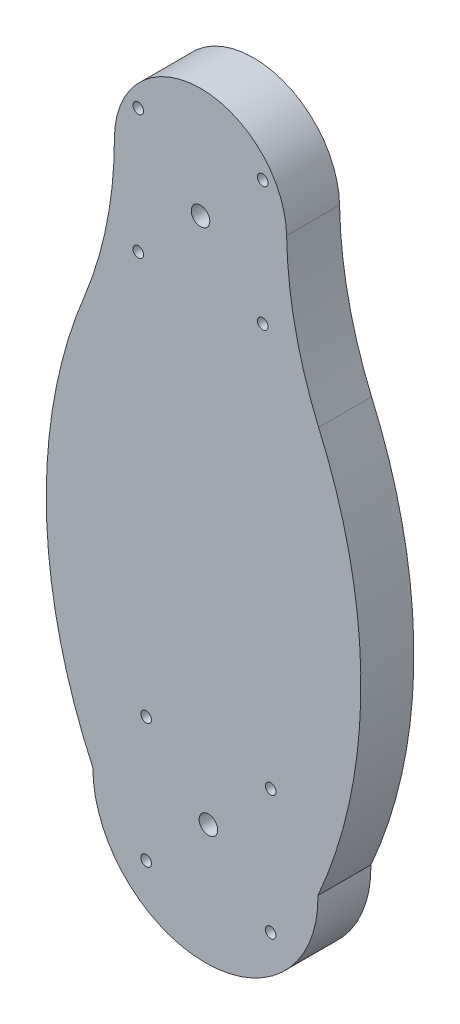
ISO-10303-21;
HEADER;
FILE_DESCRIPTION(('STEP AP214'),'2;1');
FILE_NAME('part.step','',(''),(''),'','','');
FILE_SCHEMA(('AUTOMOTIVE_DESIGN { 1 0 10303 214 1 1 1 1 }'));
ENDSEC;
DATA;
#1=APPLICATION_CONTEXT('core data for automotive mechanical design processes');
#2=APPLICATION_PROTOCOL_DEFINITION('international standard','automotive_design',2000,#1);
#3=PRODUCT_CONTEXT('',#1,'mechanical');
#4=PRODUCT('Part','Part','',(#3));
#5=PRODUCT_RELATED_PRODUCT_CATEGORY('part','',(#4));
#6=PRODUCT_DEFINITION_FORMATION('','',#4);
#7=PRODUCT_DEFINITION_CONTEXT('part definition',#1,'design');
#8=PRODUCT_DEFINITION('design','',#6,#7);
#9=PRODUCT_DEFINITION_SHAPE('','',#8);
#10=(LENGTH_UNIT() NAMED_UNIT(*) SI_UNIT(.MILLI.,.METRE.));
#11=(NAMED_UNIT(*) PLANE_ANGLE_UNIT() SI_UNIT($,.RADIAN.));
#12=(NAMED_UNIT(*) SI_UNIT($,.STERADIAN.) SOLID_ANGLE_UNIT());
#13=UNCERTAINTY_MEASURE_WITH_UNIT(LENGTH_MEASURE(1.E-05),#10,'distance_accuracy_value','');
#14=(GEOMETRIC_REPRESENTATION_CONTEXT(3) GLOBAL_UNCERTAINTY_ASSIGNED_CONTEXT((#13)) GLOBAL_UNIT_ASSIGNED_CONTEXT((#10,
#11,#12)) REPRESENTATION_CONTEXT('',''));
#15=CARTESIAN_POINT('',(0.,0.,0.));
#16=DIRECTION('',(0.,0.,1.));
#17=DIRECTION('',(1.,0.,0.));
#18=AXIS2_PLACEMENT_3D('',#15,#16,#17);
#19=CARTESIAN_POINT('',(-185.472627062232,165.030575769982,20.));
#20=DIRECTION('',(0.,0.,-1.));
#21=DIRECTION('',(-1.,0.,0.));
#22=AXIS2_PLACEMENT_3D('',#19,#20,#21);
#23=CYLINDRICAL_SURFACE('',#22,151.128455090654);
#24=CARTESIAN_POINT('',(-185.472627062232,165.030575769982,0.));
#25=DIRECTION('',(0.,0.,-1.));
#26=DIRECTION('',(-1.,0.,0.));
#27=AXIS2_PLACEMENT_3D('',#24,#25,#26);
#28=CIRCLE('',#27,151.128455090654);
#29=CARTESIAN_POINT('',(-34.344171971578,165.030575769983,0.));
#30=VERTEX_POINT('',#29);
#31=CARTESIAN_POINT('',(-45.4471219229253,108.174020751499,0.));
#32=VERTEX_POINT('',#31);
#33=EDGE_CURVE('E118',#30,#32,#28,.T.);
#34=ORIENTED_EDGE('',*,*,#33,.T.);
#35=DIRECTION('',(0.,0.,-1.));
#36=VECTOR('',#35,1.);
#37=CARTESIAN_POINT('',(-45.4471219229253,108.174020751499,20.));
#38=LINE('',#37,#36);
#39=CARTESIAN_POINT('',(-45.4471219229253,108.174020751499,20.));
#40=VERTEX_POINT('',#39);
#41=EDGE_CURVE('E11',#40,#32,#38,.T.);
#42=ORIENTED_EDGE('',*,*,#41,.F.);
#43=CARTESIAN_POINT('',(-185.472627062232,165.030575769982,20.));
#44=DIRECTION('',(0.,0.,-1.));
#45=DIRECTION('',(-1.,0.,0.));
#46=AXIS2_PLACEMENT_3D('',#43,#44,#45);
#47=CIRCLE('',#46,151.128455090654);
#48=CARTESIAN_POINT('',(-34.344171971578,165.030575769983,20.));
#49=VERTEX_POINT('',#48);
#50=EDGE_CURVE('E129',#49,#40,#47,.T.);
#51=ORIENTED_EDGE('',*,*,#50,.F.);
#52=DIRECTION('',(0.,0.,-1.));
#53=VECTOR('',#52,1.);
#54=CARTESIAN_POINT('',(-34.344171971578,165.030575769983,20.));
#55=LINE('',#54,#53);
#56=EDGE_CURVE('E114',#49,#30,#55,.T.);
#57=ORIENTED_EDGE('',*,*,#56,.T.);
#58=EDGE_LOOP('',(#34,#42,#51,#57));
#59=FACE_BOUND('',#58,.T.);
#60=ADVANCED_FACE('F34',(#59),#23,.F.);
#61=CARTESIAN_POINT('',(130.368968179079,34.957379438328,20.));
#62=DIRECTION('',(0.,0.,-1.));
#63=DIRECTION('',(-1.,0.,0.));
#64=AXIS2_PLACEMENT_3D('',#61,#62,#63);
#65=CYLINDRICAL_SURFACE('',#64,190.452025728102);
#66=CARTESIAN_POINT('',(130.368968179079,34.957379438328,0.));
#67=DIRECTION('',(0.,0.,1.));
#68=DIRECTION('',(1.,0.,0.));
#69=AXIS2_PLACEMENT_3D('',#66,#67,#68);
#70=CIRCLE('',#69,190.452025728102);
#71=CARTESIAN_POINT('',(-42.5,-44.9694242300174,0.));
#72=VERTEX_POINT('',#71);
#73=EDGE_CURVE('E121',#32,#72,#70,.T.);
#74=ORIENTED_EDGE('',*,*,#73,.T.);
#75=DIRECTION('',(0.,0.,-1.));
#76=VECTOR('',#75,1.);
#77=CARTESIAN_POINT('',(-42.5,-44.9694242300174,20.));
#78=LINE('',#77,#76);
#79=CARTESIAN_POINT('',(-42.5,-44.9694242300174,20.));
#80=VERTEX_POINT('',#79);
#81=EDGE_CURVE('E42',#80,#72,#78,.T.);
#82=ORIENTED_EDGE('',*,*,#81,.F.);
#83=CARTESIAN_POINT('',(130.368968179079,34.957379438328,20.));
#84=DIRECTION('',(0.,0.,1.));
#85=DIRECTION('',(1.,0.,0.));
#86=AXIS2_PLACEMENT_3D('',#83,#84,#85);
#87=CIRCLE('',#86,190.452025728102);
#88=EDGE_CURVE('E87',#40,#80,#87,.T.);
#89=ORIENTED_EDGE('',*,*,#88,.F.);
#90=ORIENTED_EDGE('',*,*,#41,.T.);
#91=EDGE_LOOP('',(#74,#82,#89,#90));
#92=FACE_BOUND('',#91,.T.);
#93=ADVANCED_FACE('F154',(#92),#65,.T.);
#94=CARTESIAN_POINT('',(0.,-44.9694242300174,20.));
#95=DIRECTION('',(0.,0.,-1.));
#96=DIRECTION('',(-1.,0.,0.));
#97=AXIS2_PLACEMENT_3D('',#94,#95,#96);
#98=CYLINDRICAL_SURFACE('',#97,42.5);
#99=CARTESIAN_POINT('',(0.,-44.9694242300174,0.));
#100=DIRECTION('',(0.,0.,1.));
#101=DIRECTION('',(1.,0.,0.));
#102=AXIS2_PLACEMENT_3D('',#99,#100,#101);
#103=CIRCLE('',#102,42.5);
#104=CARTESIAN_POINT('',(42.4934453473926,-44.223031231553,0.));
#105=VERTEX_POINT('',#104);
#106=EDGE_CURVE('E124',#72,#105,#103,.T.);
#107=ORIENTED_EDGE('',*,*,#106,.T.);
#108=DIRECTION('',(0.,0.,-1.));
#109=VECTOR('',#108,1.);
#110=CARTESIAN_POINT('',(42.4934453473926,-44.223031231553,20.));
#111=LINE('',#110,#109);
#112=CARTESIAN_POINT('',(42.4934453473926,-44.223031231553,20.));
#113=VERTEX_POINT('',#112);
#114=EDGE_CURVE('E109',#113,#105,#111,.T.);
#115=ORIENTED_EDGE('',*,*,#114,.F.);
#116=CARTESIAN_POINT('',(0.,-44.9694242300174,20.));
#117=DIRECTION('',(0.,0.,1.));
#118=DIRECTION('',(1.,0.,0.));
#119=AXIS2_PLACEMENT_3D('',#116,#117,#118);
#120=CIRCLE('',#119,42.5);
#121=EDGE_CURVE('E100',#80,#113,#120,.T.);
#122=ORIENTED_EDGE('',*,*,#121,.F.);
#123=ORIENTED_EDGE('',*,*,#81,.T.);
#124=EDGE_LOOP('',(#107,#115,#122,#123));
#125=FACE_BOUND('',#124,.T.);
#126=ADVANCED_FACE('F135',(#125),#98,.T.);
#127=CARTESIAN_POINT('',(-131.752551316738,32.6554882030822,20.));
#128=DIRECTION('',(0.,0.,-1.));
#129=DIRECTION('',(-1.,0.,0.));
#130=AXIS2_PLACEMENT_3D('',#127,#128,#129);
#131=CYLINDRICAL_SURFACE('',#130,190.452025728102);
#132=CARTESIAN_POINT('',(-131.752551316738,32.6554882030822,0.));
#133=DIRECTION('',(0.,0.,1.));
#134=DIRECTION('',(-1.,0.,0.));
#135=AXIS2_PLACEMENT_3D('',#132,#133,#134);
#136=CIRCLE('',#135,190.452025728102);
#137=CARTESIAN_POINT('',(42.7505787419578,108.948552787327,0.));
#138=VERTEX_POINT('',#137);
#139=EDGE_CURVE('E108',#105,#138,#136,.T.);
#140=ORIENTED_EDGE('',*,*,#139,.T.);
#141=DIRECTION('',(0.,0.,-1.));
#142=VECTOR('',#141,1.);
#143=CARTESIAN_POINT('',(42.7505787419578,108.948552787327,20.));
#144=LINE('',#143,#142);
#145=CARTESIAN_POINT('',(42.7505787419578,108.948552787327,20.));
#146=VERTEX_POINT('',#145);
#147=EDGE_CURVE('E105',#146,#138,#144,.T.);
#148=ORIENTED_EDGE('',*,*,#147,.F.);
#149=CARTESIAN_POINT('',(-131.752551316738,32.6554882030822,20.));
#150=DIRECTION('',(0.,0.,1.));
#151=DIRECTION('',(-1.,0.,0.));
#152=AXIS2_PLACEMENT_3D('',#149,#150,#151);
#153=CIRCLE('',#152,190.452025728102);
#154=EDGE_CURVE('E94',#113,#146,#153,.T.);
#155=ORIENTED_EDGE('',*,*,#154,.F.);
#156=ORIENTED_EDGE('',*,*,#114,.T.);
#157=EDGE_LOOP('',(#140,#148,#155,#156));
#158=FACE_BOUND('',#157,.T.);
#159=ADVANCED_FACE('F106',(#158),#131,.T.);
#160=CARTESIAN_POINT('',(181.755962631265,168.255493257006,20.));
#161=DIRECTION('',(0.,0.,-1.));
#162=DIRECTION('',(-1.,0.,0.));
#163=AXIS2_PLACEMENT_3D('',#160,#161,#162);
#164=CYLINDRICAL_SURFACE('',#163,151.128455090654);
#165=CARTESIAN_POINT('',(181.755962631265,168.255493257006,0.));
#166=DIRECTION('',(0.,0.,-1.));
#167=DIRECTION('',(1.,0.,0.));
#168=AXIS2_PLACEMENT_3D('',#165,#166,#167);
#169=CIRCLE('',#168,151.128455090654);
#170=CARTESIAN_POINT('',(30.6508156470164,165.601346886455,0.));
#171=VERTEX_POINT('',#170);
#172=EDGE_CURVE('E73',#138,#171,#169,.T.);
#173=ORIENTED_EDGE('',*,*,#172,.T.);
#174=DIRECTION('',(0.,0.,-1.));
#175=VECTOR('',#174,1.);
#176=CARTESIAN_POINT('',(30.6508156470164,165.601346886455,20.));
#177=LINE('',#176,#175);
#178=CARTESIAN_POINT('',(30.6508156470164,165.601346886455,20.));
#179=VERTEX_POINT('',#178);
#180=EDGE_CURVE('E110',#179,#171,#177,.T.);
#181=ORIENTED_EDGE('',*,*,#180,.F.);
#182=CARTESIAN_POINT('',(181.755962631265,168.255493257006,20.));
#183=DIRECTION('',(0.,0.,-1.));
#184=DIRECTION('',(1.,0.,0.));
#185=AXIS2_PLACEMENT_3D('',#182,#183,#184);
#186=CIRCLE('',#185,151.128455090654);
#187=EDGE_CURVE('E98',#146,#179,#186,.T.);
#188=ORIENTED_EDGE('',*,*,#187,.F.);
#189=ORIENTED_EDGE('',*,*,#147,.T.);
#190=EDGE_LOOP('',(#173,#181,#188,#189));
#191=FACE_BOUND('',#190,.T.);
#192=ADVANCED_FACE('F112',(#191),#164,.F.);
#193=CARTESIAN_POINT('',(-1.84417197157799,165.030575769983,20.));
#194=DIRECTION('',(0.,0.,-1.));
#195=DIRECTION('',(-1.,0.,0.));
#196=AXIS2_PLACEMENT_3D('',#193,#194,#195);
#197=CYLINDRICAL_SURFACE('',#196,32.5);
#198=CARTESIAN_POINT('',(-1.84417197157799,165.030575769983,0.));
#199=DIRECTION('',(0.,0.,1.));
#200=DIRECTION('',(1.,0.,0.));
#201=AXIS2_PLACEMENT_3D('',#198,#199,#200);
#202=CIRCLE('',#201,32.5);
#203=EDGE_CURVE('E79',#171,#30,#202,.T.);
#204=ORIENTED_EDGE('',*,*,#203,.T.);
#205=ORIENTED_EDGE('',*,*,#56,.F.);
#206=CARTESIAN_POINT('',(-1.84417197157799,165.030575769983,20.));
#207=DIRECTION('',(0.,0.,1.));
#208=DIRECTION('',(1.,0.,0.));
#209=AXIS2_PLACEMENT_3D('',#206,#207,#208);
#210=CIRCLE('',#209,32.5);
#211=EDGE_CURVE('E50',#179,#49,#210,.T.);
#212=ORIENTED_EDGE('',*,*,#211,.F.);
#213=ORIENTED_EDGE('',*,*,#180,.T.);
#214=EDGE_LOOP('',(#204,#205,#212,#213));
#215=FACE_BOUND('',#214,.T.);
#216=ADVANCED_FACE('F142',(#215),#197,.T.);
#217=CARTESIAN_POINT('',(-27.5518294415763,99.9939776041552,20.));
#218=DIRECTION('',(0.,0.,-1.));
#219=DIRECTION('',(-1.,0.,0.));
#220=AXIS2_PLACEMENT_3D('',#217,#218,#219);
#221=PLANE('',#220);
#222=CARTESIAN_POINT('',(-22.3673989171559,-65.2473297391178,20.));
#223=DIRECTION('',(0.,0.,1.));
#224=DIRECTION('',(1.,0.,0.));
#225=AXIS2_PLACEMENT_3D('',#222,#223,#224);
#226=CIRCLE('',#225,2.);
#227=CARTESIAN_POINT('',(-20.3673989171559,-65.2473297391178,20.));
#228=VERTEX_POINT('',#227);
#229=EDGE_CURVE('E300',#228,#228,#226,.T.);
#230=ORIENTED_EDGE('',*,*,#229,.F.);
#231=EDGE_LOOP('',(#230));
#232=FACE_BOUND('',#231,.T.);
#233=CARTESIAN_POINT('',(24.6326010828441,-65.2473297391178,20.));
#234=DIRECTION('',(0.,0.,1.));
#235=DIRECTION('',(1.,0.,0.));
#236=AXIS2_PLACEMENT_3D('',#233,#234,#235);
#237=CIRCLE('',#236,2.);
#238=CARTESIAN_POINT('',(26.6326010828441,-65.2473297391178,20.));
#239=VERTEX_POINT('',#238);
#240=EDGE_CURVE('E302',#239,#239,#237,.T.);
#241=ORIENTED_EDGE('',*,*,#240,.F.);
#242=EDGE_LOOP('',(#241));
#243=FACE_BOUND('',#242,.T.);
#244=CARTESIAN_POINT('',(-22.3673989171559,-18.2473297391178,20.));
#245=DIRECTION('',(0.,0.,1.));
#246=DIRECTION('',(1.,0.,0.));
#247=AXIS2_PLACEMENT_3D('',#244,#245,#246);
#248=CIRCLE('',#247,2.);
#249=CARTESIAN_POINT('',(-20.3673989171559,-18.2473297391178,20.));
#250=VERTEX_POINT('',#249);
#251=EDGE_CURVE('E381',#250,#250,#248,.T.);
#252=ORIENTED_EDGE('',*,*,#251,.F.);
#253=EDGE_LOOP('',(#252));
#254=FACE_BOUND('',#253,.T.);
#255=CARTESIAN_POINT('',(24.6326010828441,-18.2473297391178,20.));
#256=DIRECTION('',(0.,0.,1.));
#257=DIRECTION('',(1.,0.,0.));
#258=AXIS2_PLACEMENT_3D('',#255,#256,#257);
#259=CIRCLE('',#258,2.);
#260=CARTESIAN_POINT('',(26.6326010828441,-18.2473297391178,20.));
#261=VERTEX_POINT('',#260);
#262=EDGE_CURVE('E371',#261,#261,#259,.T.);
#263=ORIENTED_EDGE('',*,*,#262,.F.);
#264=EDGE_LOOP('',(#263));
#265=FACE_BOUND('',#264,.T.);
#266=CARTESIAN_POINT('',(1.13260108284408,-41.7473297391178,20.));
#267=DIRECTION('',(0.,0.,1.));
#268=DIRECTION('',(1.,0.,0.));
#269=AXIS2_PLACEMENT_3D('',#266,#267,#268);
#270=CIRCLE('',#269,3.5);
#271=CARTESIAN_POINT('',(4.63260108284408,-41.7473297391178,20.));
#272=VERTEX_POINT('',#271);
#273=EDGE_CURVE('E310',#272,#272,#270,.T.);
#274=ORIENTED_EDGE('',*,*,#273,.F.);
#275=EDGE_LOOP('',(#274));
#276=FACE_BOUND('',#275,.T.);
#277=CARTESIAN_POINT('',(-25.344171971578,132.298868961037,20.));
#278=DIRECTION('',(0.,0.,1.));
#279=DIRECTION('',(1.,0.,0.));
#280=AXIS2_PLACEMENT_3D('',#277,#278,#279);
#281=CIRCLE('',#280,2.);
#282=CARTESIAN_POINT('',(-23.344171971578,132.298868961037,20.));
#283=VERTEX_POINT('',#282);
#284=EDGE_CURVE('E309',#283,#283,#281,.T.);
#285=ORIENTED_EDGE('',*,*,#284,.F.);
#286=EDGE_LOOP('',(#285));
#287=FACE_BOUND('',#286,.T.);
#288=CARTESIAN_POINT('',(21.655828028422,132.298868961037,20.));
#289=DIRECTION('',(0.,0.,1.));
#290=DIRECTION('',(1.,0.,0.));
#291=AXIS2_PLACEMENT_3D('',#288,#289,#290);
#292=CIRCLE('',#291,2.);
#293=CARTESIAN_POINT('',(23.655828028422,132.298868961037,20.));
#294=VERTEX_POINT('',#293);
#295=EDGE_CURVE('E330',#294,#294,#292,.T.);
#296=ORIENTED_EDGE('',*,*,#295,.F.);
#297=EDGE_LOOP('',(#296));
#298=FACE_BOUND('',#297,.T.);
#299=CARTESIAN_POINT('',(-25.344171971578,179.298868961037,20.));
#300=DIRECTION('',(0.,0.,1.));
#301=DIRECTION('',(1.,0.,0.));
#302=AXIS2_PLACEMENT_3D('',#299,#300,#301);
#303=CIRCLE('',#302,2.);
#304=CARTESIAN_POINT('',(-23.344171971578,179.298868961037,20.));
#305=VERTEX_POINT('',#304);
#306=EDGE_CURVE('E324',#305,#305,#303,.T.);
#307=ORIENTED_EDGE('',*,*,#306,.F.);
#308=EDGE_LOOP('',(#307));
#309=FACE_BOUND('',#308,.T.);
#310=CARTESIAN_POINT('',(21.655828028422,179.298868961037,20.));
#311=DIRECTION('',(0.,0.,1.));
#312=DIRECTION('',(1.,0.,0.));
#313=AXIS2_PLACEMENT_3D('',#310,#311,#312);
#314=CIRCLE('',#313,2.);
#315=CARTESIAN_POINT('',(23.655828028422,179.298868961037,20.));
#316=VERTEX_POINT('',#315);
#317=EDGE_CURVE('E318',#316,#316,#314,.T.);
#318=ORIENTED_EDGE('',*,*,#317,.F.);
#319=EDGE_LOOP('',(#318));
#320=FACE_BOUND('',#319,.T.);
#321=CARTESIAN_POINT('',(-1.84417197157799,155.798868961037,20.));
#322=DIRECTION('',(0.,0.,1.));
#323=DIRECTION('',(1.,0.,0.));
#324=AXIS2_PLACEMENT_3D('',#321,#322,#323);
#325=CIRCLE('',#324,3.5);
#326=CARTESIAN_POINT('',(1.65582802842201,155.798868961037,20.));
#327=VERTEX_POINT('',#326);
#328=EDGE_CURVE('E317',#327,#327,#325,.T.);
#329=ORIENTED_EDGE('',*,*,#328,.F.);
#330=EDGE_LOOP('',(#329));
#331=FACE_BOUND('',#330,.T.);
#332=ORIENTED_EDGE('',*,*,#50,.T.);
#333=ORIENTED_EDGE('',*,*,#88,.T.);
#334=ORIENTED_EDGE('',*,*,#121,.T.);
#335=ORIENTED_EDGE('',*,*,#154,.T.);
#336=ORIENTED_EDGE('',*,*,#187,.T.);
#337=ORIENTED_EDGE('',*,*,#211,.T.);
#338=EDGE_LOOP('',(#332,#333,#334,#335,#336,#337));
#339=FACE_BOUND('',#338,.T.);
#340=ADVANCED_FACE('F96',(#232,#243,#254,#265,#276,#287,#298,#309,#320,#331,#339),#221,.F.);
#341=CARTESIAN_POINT('',(-27.5518294415763,99.9939776041552,0.));
#342=DIRECTION('',(0.,0.,-1.));
#343=DIRECTION('',(-1.,0.,0.));
#344=AXIS2_PLACEMENT_3D('',#341,#342,#343);
#345=PLANE('',#344);
#346=CARTESIAN_POINT('',(-22.3673989171559,-65.2473297391178,0.));
#347=DIRECTION('',(0.,0.,1.));
#348=DIRECTION('',(1.,0.,0.));
#349=AXIS2_PLACEMENT_3D('',#346,#347,#348);
#350=CIRCLE('',#349,2.);
#351=CARTESIAN_POINT('',(-20.3673989171559,-65.2473297391178,0.));
#352=VERTEX_POINT('',#351);
#353=EDGE_CURVE('E297',#352,#352,#350,.T.);
#354=ORIENTED_EDGE('',*,*,#353,.T.);
#355=EDGE_LOOP('',(#354));
#356=FACE_BOUND('',#355,.T.);
#357=CARTESIAN_POINT('',(24.6326010828441,-65.2473297391178,0.));
#358=DIRECTION('',(0.,0.,1.));
#359=DIRECTION('',(1.,0.,0.));
#360=AXIS2_PLACEMENT_3D('',#357,#358,#359);
#361=CIRCLE('',#360,2.);
#362=CARTESIAN_POINT('',(26.6326010828441,-65.2473297391178,0.));
#363=VERTEX_POINT('',#362);
#364=EDGE_CURVE('E384',#363,#363,#361,.T.);
#365=ORIENTED_EDGE('',*,*,#364,.T.);
#366=EDGE_LOOP('',(#365));
#367=FACE_BOUND('',#366,.T.);
#368=CARTESIAN_POINT('',(-22.3673989171559,-18.2473297391178,0.));
#369=DIRECTION('',(0.,0.,1.));
#370=DIRECTION('',(1.,0.,0.));
#371=AXIS2_PLACEMENT_3D('',#368,#369,#370);
#372=CIRCLE('',#371,2.);
#373=CARTESIAN_POINT('',(-20.3673989171559,-18.2473297391178,0.));
#374=VERTEX_POINT('',#373);
#375=EDGE_CURVE('E376',#374,#374,#372,.T.);
#376=ORIENTED_EDGE('',*,*,#375,.T.);
#377=EDGE_LOOP('',(#376));
#378=FACE_BOUND('',#377,.T.);
#379=CARTESIAN_POINT('',(24.6326010828441,-18.2473297391178,0.));
#380=DIRECTION('',(0.,0.,1.));
#381=DIRECTION('',(1.,0.,0.));
#382=AXIS2_PLACEMENT_3D('',#379,#380,#381);
#383=CIRCLE('',#382,2.);
#384=CARTESIAN_POINT('',(26.6326010828441,-18.2473297391178,0.));
#385=VERTEX_POINT('',#384);
#386=EDGE_CURVE('E313',#385,#385,#383,.T.);
#387=ORIENTED_EDGE('',*,*,#386,.T.);
#388=EDGE_LOOP('',(#387));
#389=FACE_BOUND('',#388,.T.);
#390=CARTESIAN_POINT('',(1.13260108284408,-41.7473297391178,0.));
#391=DIRECTION('',(0.,0.,1.));
#392=DIRECTION('',(1.,0.,0.));
#393=AXIS2_PLACEMENT_3D('',#390,#391,#392);
#394=CIRCLE('',#393,3.5);
#395=CARTESIAN_POINT('',(4.63260108284408,-41.7473297391178,0.));
#396=VERTEX_POINT('',#395);
#397=EDGE_CURVE('E306',#396,#396,#394,.T.);
#398=ORIENTED_EDGE('',*,*,#397,.T.);
#399=EDGE_LOOP('',(#398));
#400=FACE_BOUND('',#399,.T.);
#401=CARTESIAN_POINT('',(-25.344171971578,132.298868961037,0.));
#402=DIRECTION('',(0.,0.,1.));
#403=DIRECTION('',(1.,0.,0.));
#404=AXIS2_PLACEMENT_3D('',#401,#402,#403);
#405=CIRCLE('',#404,2.);
#406=CARTESIAN_POINT('',(-23.344171971578,132.298868961037,0.));
#407=VERTEX_POINT('',#406);
#408=EDGE_CURVE('E333',#407,#407,#405,.T.);
#409=ORIENTED_EDGE('',*,*,#408,.T.);
#410=EDGE_LOOP('',(#409));
#411=FACE_BOUND('',#410,.T.);
#412=CARTESIAN_POINT('',(21.655828028422,132.298868961037,0.));
#413=DIRECTION('',(0.,0.,1.));
#414=DIRECTION('',(1.,0.,0.));
#415=AXIS2_PLACEMENT_3D('',#412,#413,#414);
#416=CIRCLE('',#415,2.);
#417=CARTESIAN_POINT('',(23.655828028422,132.298868961037,0.));
#418=VERTEX_POINT('',#417);
#419=EDGE_CURVE('E327',#418,#418,#416,.T.);
#420=ORIENTED_EDGE('',*,*,#419,.T.);
#421=EDGE_LOOP('',(#420));
#422=FACE_BOUND('',#421,.T.);
#423=CARTESIAN_POINT('',(-25.344171971578,179.298868961037,0.));
#424=DIRECTION('',(0.,0.,1.));
#425=DIRECTION('',(1.,0.,0.));
#426=AXIS2_PLACEMENT_3D('',#423,#424,#425);
#427=CIRCLE('',#426,2.);
#428=CARTESIAN_POINT('',(-23.344171971578,179.298868961037,0.));
#429=VERTEX_POINT('',#428);
#430=EDGE_CURVE('E321',#429,#429,#427,.T.);
#431=ORIENTED_EDGE('',*,*,#430,.T.);
#432=EDGE_LOOP('',(#431));
#433=FACE_BOUND('',#432,.T.);
#434=CARTESIAN_POINT('',(21.655828028422,179.298868961037,0.));
#435=DIRECTION('',(0.,0.,1.));
#436=DIRECTION('',(1.,0.,0.));
#437=AXIS2_PLACEMENT_3D('',#434,#435,#436);
#438=CIRCLE('',#437,2.);
#439=CARTESIAN_POINT('',(23.655828028422,179.298868961037,0.));
#440=VERTEX_POINT('',#439);
#441=EDGE_CURVE('E314',#440,#440,#438,.T.);
#442=ORIENTED_EDGE('',*,*,#441,.T.);
#443=EDGE_LOOP('',(#442));
#444=FACE_BOUND('',#443,.T.);
#445=CARTESIAN_POINT('',(-1.84417197157799,155.798868961037,0.));
#446=DIRECTION('',(0.,0.,1.));
#447=DIRECTION('',(1.,0.,0.));
#448=AXIS2_PLACEMENT_3D('',#445,#446,#447);
#449=CIRCLE('',#448,3.5);
#450=CARTESIAN_POINT('',(1.65582802842201,155.798868961037,0.));
#451=VERTEX_POINT('',#450);
#452=EDGE_CURVE('E122',#451,#451,#449,.T.);
#453=ORIENTED_EDGE('',*,*,#452,.T.);
#454=EDGE_LOOP('',(#453));
#455=FACE_BOUND('',#454,.T.);
#456=ORIENTED_EDGE('',*,*,#33,.F.);
#457=ORIENTED_EDGE('',*,*,#203,.F.);
#458=ORIENTED_EDGE('',*,*,#172,.F.);
#459=ORIENTED_EDGE('',*,*,#139,.F.);
#460=ORIENTED_EDGE('',*,*,#106,.F.);
#461=ORIENTED_EDGE('',*,*,#73,.F.);
#462=EDGE_LOOP('',(#456,#457,#458,#459,#460,#461));
#463=FACE_BOUND('',#462,.T.);
#464=ADVANCED_FACE('F138',(#356,#367,#378,#389,#400,#411,#422,#433,#444,#455,#463),#345,.T.);
#465=CARTESIAN_POINT('',(-1.84417197157799,155.798868961037,0.));
#466=DIRECTION('',(0.,0.,1.));
#467=DIRECTION('',(1.,0.,0.));
#468=AXIS2_PLACEMENT_3D('',#465,#466,#467);
#469=CYLINDRICAL_SURFACE('',#468,3.5);
#470=ORIENTED_EDGE('',*,*,#452,.F.);
#471=EDGE_LOOP('',(#470));
#472=FACE_BOUND('',#471,.T.);
#473=ORIENTED_EDGE('',*,*,#328,.T.);
#474=EDGE_LOOP('',(#473));
#475=FACE_BOUND('',#474,.T.);
#476=ADVANCED_FACE('F182',(#472,#475),#469,.F.);
#477=CARTESIAN_POINT('',(21.655828028422,179.298868961037,0.));
#478=DIRECTION('',(0.,0.,1.));
#479=DIRECTION('',(1.,0.,0.));
#480=AXIS2_PLACEMENT_3D('',#477,#478,#479);
#481=CYLINDRICAL_SURFACE('',#480,2.);
#482=ORIENTED_EDGE('',*,*,#441,.F.);
#483=EDGE_LOOP('',(#482));
#484=FACE_BOUND('',#483,.T.);
#485=ORIENTED_EDGE('',*,*,#317,.T.);
#486=EDGE_LOOP('',(#485));
#487=FACE_BOUND('',#486,.T.);
#488=ADVANCED_FACE('F187',(#484,#487),#481,.F.);
#489=CARTESIAN_POINT('',(-25.344171971578,179.298868961037,0.));
#490=DIRECTION('',(0.,0.,1.));
#491=DIRECTION('',(1.,0.,0.));
#492=AXIS2_PLACEMENT_3D('',#489,#490,#491);
#493=CYLINDRICAL_SURFACE('',#492,2.);
#494=ORIENTED_EDGE('',*,*,#430,.F.);
#495=EDGE_LOOP('',(#494));
#496=FACE_BOUND('',#495,.T.);
#497=ORIENTED_EDGE('',*,*,#306,.T.);
#498=EDGE_LOOP('',(#497));
#499=FACE_BOUND('',#498,.T.);
#500=ADVANCED_FACE('F199',(#496,#499),#493,.F.);
#501=CARTESIAN_POINT('',(21.655828028422,132.298868961037,0.));
#502=DIRECTION('',(0.,0.,1.));
#503=DIRECTION('',(1.,0.,0.));
#504=AXIS2_PLACEMENT_3D('',#501,#502,#503);
#505=CYLINDRICAL_SURFACE('',#504,2.);
#506=ORIENTED_EDGE('',*,*,#419,.F.);
#507=EDGE_LOOP('',(#506));
#508=FACE_BOUND('',#507,.T.);
#509=ORIENTED_EDGE('',*,*,#295,.T.);
#510=EDGE_LOOP('',(#509));
#511=FACE_BOUND('',#510,.T.);
#512=ADVANCED_FACE('F209',(#508,#511),#505,.F.);
#513=CARTESIAN_POINT('',(-25.344171971578,132.298868961037,0.));
#514=DIRECTION('',(0.,0.,1.));
#515=DIRECTION('',(1.,0.,0.));
#516=AXIS2_PLACEMENT_3D('',#513,#514,#515);
#517=CYLINDRICAL_SURFACE('',#516,2.);
#518=ORIENTED_EDGE('',*,*,#408,.F.);
#519=EDGE_LOOP('',(#518));
#520=FACE_BOUND('',#519,.T.);
#521=ORIENTED_EDGE('',*,*,#284,.T.);
#522=EDGE_LOOP('',(#521));
#523=FACE_BOUND('',#522,.T.);
#524=ADVANCED_FACE('F219',(#520,#523),#517,.F.);
#525=CARTESIAN_POINT('',(1.13260108284408,-41.7473297391178,0.));
#526=DIRECTION('',(0.,0.,1.));
#527=DIRECTION('',(1.,0.,0.));
#528=AXIS2_PLACEMENT_3D('',#525,#526,#527);
#529=CYLINDRICAL_SURFACE('',#528,3.5);
#530=ORIENTED_EDGE('',*,*,#397,.F.);
#531=EDGE_LOOP('',(#530));
#532=FACE_BOUND('',#531,.T.);
#533=ORIENTED_EDGE('',*,*,#273,.T.);
#534=EDGE_LOOP('',(#533));
#535=FACE_BOUND('',#534,.T.);
#536=ADVANCED_FACE('F229',(#532,#535),#529,.F.);
#537=CARTESIAN_POINT('',(24.6326010828441,-18.2473297391178,0.));
#538=DIRECTION('',(0.,0.,1.));
#539=DIRECTION('',(1.,0.,0.));
#540=AXIS2_PLACEMENT_3D('',#537,#538,#539);
#541=CYLINDRICAL_SURFACE('',#540,2.);
#542=ORIENTED_EDGE('',*,*,#386,.F.);
#543=EDGE_LOOP('',(#542));
#544=FACE_BOUND('',#543,.T.);
#545=ORIENTED_EDGE('',*,*,#262,.T.);
#546=EDGE_LOOP('',(#545));
#547=FACE_BOUND('',#546,.T.);
#548=ADVANCED_FACE('F250',(#544,#547),#541,.F.);
#549=CARTESIAN_POINT('',(-22.3673989171559,-18.2473297391178,0.));
#550=DIRECTION('',(0.,0.,1.));
#551=DIRECTION('',(1.,0.,0.));
#552=AXIS2_PLACEMENT_3D('',#549,#550,#551);
#553=CYLINDRICAL_SURFACE('',#552,2.);
#554=ORIENTED_EDGE('',*,*,#375,.F.);
#555=EDGE_LOOP('',(#554));
#556=FACE_BOUND('',#555,.T.);
#557=ORIENTED_EDGE('',*,*,#251,.T.);
#558=EDGE_LOOP('',(#557));
#559=FACE_BOUND('',#558,.T.);
#560=ADVANCED_FACE('F260',(#556,#559),#553,.F.);
#561=CARTESIAN_POINT('',(24.6326010828441,-65.2473297391178,0.));
#562=DIRECTION('',(0.,0.,1.));
#563=DIRECTION('',(1.,0.,0.));
#564=AXIS2_PLACEMENT_3D('',#561,#562,#563);
#565=CYLINDRICAL_SURFACE('',#564,2.);
#566=ORIENTED_EDGE('',*,*,#364,.F.);
#567=EDGE_LOOP('',(#566));
#568=FACE_BOUND('',#567,.T.);
#569=ORIENTED_EDGE('',*,*,#240,.T.);
#570=EDGE_LOOP('',(#569));
#571=FACE_BOUND('',#570,.T.);
#572=ADVANCED_FACE('F270',(#568,#571),#565,.F.);
#573=CARTESIAN_POINT('',(-22.3673989171559,-65.2473297391178,0.));
#574=DIRECTION('',(0.,0.,1.));
#575=DIRECTION('',(1.,0.,0.));
#576=AXIS2_PLACEMENT_3D('',#573,#574,#575);
#577=CYLINDRICAL_SURFACE('',#576,2.);
#578=ORIENTED_EDGE('',*,*,#353,.F.);
#579=EDGE_LOOP('',(#578));
#580=FACE_BOUND('',#579,.T.);
#581=ORIENTED_EDGE('',*,*,#229,.T.);
#582=EDGE_LOOP('',(#581));
#583=FACE_BOUND('',#582,.T.);
#584=ADVANCED_FACE('F280',(#580,#583),#577,.F.);
#585=CLOSED_SHELL('',(#60,#93,#126,#159,#192,#216,#340,#464,#476,#488,#500,#512,#524,#536,#548,
#560,#572,#584));
#586=MANIFOLD_SOLID_BREP('B2',#585);
#587=ADVANCED_BREP_SHAPE_REPRESENTATION('',(#18,#586),#14);
#588=SHAPE_DEFINITION_REPRESENTATION(#9,#587);
ENDSEC;
END-ISO-10303-21;
